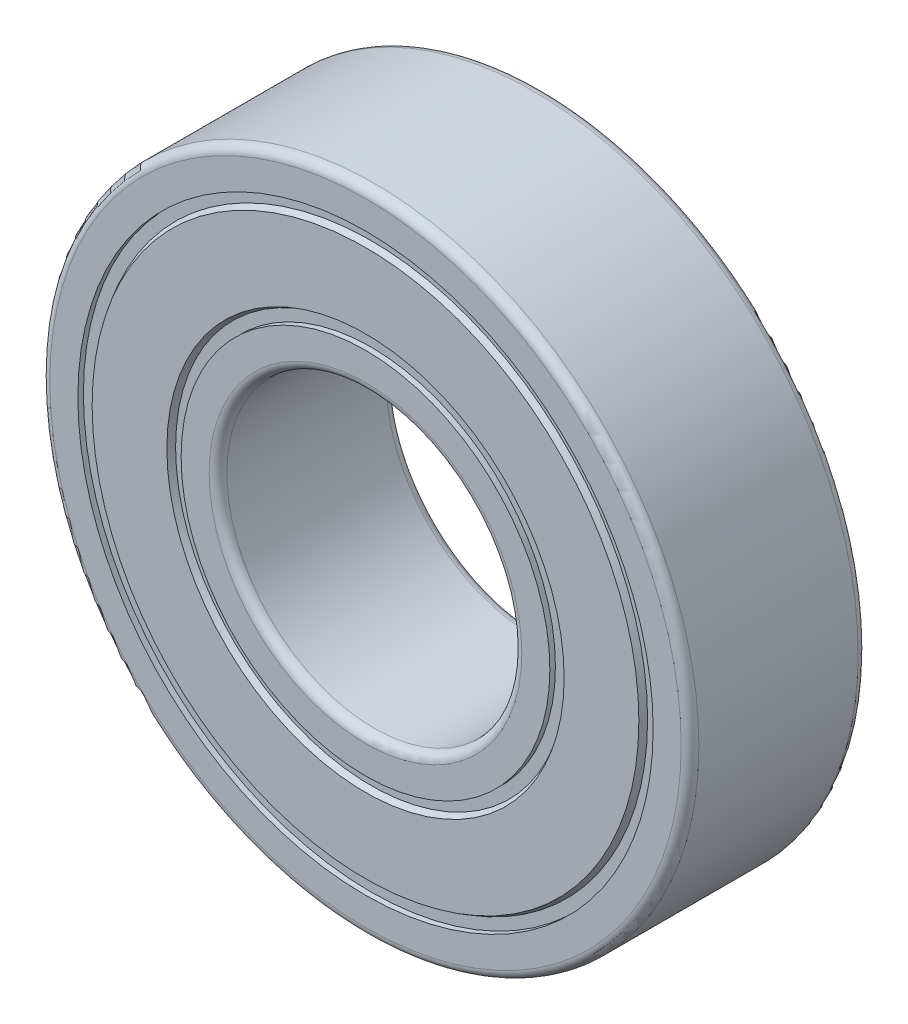
ISO-10303-21;
HEADER;
FILE_DESCRIPTION(('STEP AP214'),'2;1');
FILE_NAME('part.step','',(''),(''),'','','');
FILE_SCHEMA(('AUTOMOTIVE_DESIGN { 1 0 10303 214 1 1 1 1 }'));
ENDSEC;
DATA;
#1=APPLICATION_CONTEXT('core data for automotive mechanical design processes');
#2=APPLICATION_PROTOCOL_DEFINITION('international standard','automotive_design',2000,#1);
#3=PRODUCT_CONTEXT('',#1,'mechanical');
#4=PRODUCT('Part','Part','',(#3));
#5=PRODUCT_RELATED_PRODUCT_CATEGORY('part','',(#4));
#6=PRODUCT_DEFINITION_FORMATION('','',#4);
#7=PRODUCT_DEFINITION_CONTEXT('part definition',#1,'design');
#8=PRODUCT_DEFINITION('design','',#6,#7);
#9=PRODUCT_DEFINITION_SHAPE('','',#8);
#10=(LENGTH_UNIT() NAMED_UNIT(*) SI_UNIT(.MILLI.,.METRE.));
#11=(NAMED_UNIT(*) PLANE_ANGLE_UNIT() SI_UNIT($,.RADIAN.));
#12=(NAMED_UNIT(*) SI_UNIT($,.STERADIAN.) SOLID_ANGLE_UNIT());
#13=UNCERTAINTY_MEASURE_WITH_UNIT(LENGTH_MEASURE(1.E-05),#10,'distance_accuracy_value','');
#14=(GEOMETRIC_REPRESENTATION_CONTEXT(3) GLOBAL_UNCERTAINTY_ASSIGNED_CONTEXT((#13)) GLOBAL_UNIT_ASSIGNED_CONTEXT((#10,
#11,#12)) REPRESENTATION_CONTEXT('',''));
#15=CARTESIAN_POINT('',(0.,0.,0.));
#16=DIRECTION('',(0.,0.,1.));
#17=DIRECTION('',(1.,0.,0.));
#18=AXIS2_PLACEMENT_3D('',#15,#16,#17);
#19=CARTESIAN_POINT('',(-9.75,0.,6.));
#20=DIRECTION('',(0.,0.,-1.));
#21=DIRECTION('',(-1.,0.,0.));
#22=AXIS2_PLACEMENT_3D('',#19,#20,#21);
#23=PLANE('',#22);
#24=CARTESIAN_POINT('',(0.,0.,6.));
#25=DIRECTION('',(0.,0.,1.));
#26=DIRECTION('',(1.,0.,0.));
#27=AXIS2_PLACEMENT_3D('',#24,#25,#26);
#28=CIRCLE('',#27,9.75);
#29=CARTESIAN_POINT('',(9.75,0.,6.));
#30=VERTEX_POINT('',#29);
#31=EDGE_CURVE('E10',#30,#30,#28,.T.);
#32=ORIENTED_EDGE('',*,*,#31,.F.);
#33=EDGE_LOOP('',(#32));
#34=FACE_BOUND('',#33,.T.);
#35=CARTESIAN_POINT('',(0.,0.,6.));
#36=DIRECTION('',(0.,0.,1.));
#37=DIRECTION('',(1.,0.,0.));
#38=AXIS2_PLACEMENT_3D('',#35,#36,#37);
#39=CIRCLE('',#38,10.7);
#40=CARTESIAN_POINT('',(10.7,0.,6.));
#41=VERTEX_POINT('',#40);
#42=EDGE_CURVE('E111',#41,#41,#39,.T.);
#43=ORIENTED_EDGE('',*,*,#42,.T.);
#44=EDGE_LOOP('',(#43));
#45=FACE_BOUND('',#44,.T.);
#46=ADVANCED_FACE('F34',(#34,#45),#23,.F.);
#47=CARTESIAN_POINT('',(0.,0.,19.));
#48=DIRECTION('',(0.,0.,1.));
#49=DIRECTION('',(1.,0.,0.));
#50=AXIS2_PLACEMENT_3D('',#47,#48,#49);
#51=CYLINDRICAL_SURFACE('',#50,9.75);
#52=CARTESIAN_POINT('',(0.,0.,5.8125));
#53=DIRECTION('',(0.,0.,1.));
#54=DIRECTION('',(1.,0.,0.));
#55=AXIS2_PLACEMENT_3D('',#52,#53,#54);
#56=CIRCLE('',#55,9.75);
#57=CARTESIAN_POINT('',(9.75,0.,5.8125));
#58=VERTEX_POINT('',#57);
#59=EDGE_CURVE('E41',#58,#58,#56,.T.);
#60=ORIENTED_EDGE('',*,*,#59,.F.);
#61=EDGE_LOOP('',(#60));
#62=FACE_BOUND('',#61,.T.);
#63=ORIENTED_EDGE('',*,*,#31,.T.);
#64=EDGE_LOOP('',(#63));
#65=FACE_BOUND('',#64,.T.);
#66=ADVANCED_FACE('F244',(#62,#65),#51,.F.);
#67=CARTESIAN_POINT('',(-9.75,0.,5.8125));
#68=DIRECTION('',(0.,0.,-1.));
#69=DIRECTION('',(-1.,0.,0.));
#70=AXIS2_PLACEMENT_3D('',#67,#68,#69);
#71=PLANE('',#70);
#72=CARTESIAN_POINT('',(0.,0.,5.8125));
#73=DIRECTION('',(0.,0.,1.));
#74=DIRECTION('',(1.,0.,0.));
#75=AXIS2_PLACEMENT_3D('',#72,#73,#74);
#76=CIRCLE('',#75,9.375);
#77=CARTESIAN_POINT('',(9.375,0.,5.8125));
#78=VERTEX_POINT('',#77);
#79=EDGE_CURVE('E45',#78,#78,#76,.T.);
#80=ORIENTED_EDGE('',*,*,#79,.F.);
#81=EDGE_LOOP('',(#80));
#82=FACE_BOUND('',#81,.T.);
#83=ORIENTED_EDGE('',*,*,#59,.T.);
#84=EDGE_LOOP('',(#83));
#85=FACE_BOUND('',#84,.T.);
#86=ADVANCED_FACE('F239',(#82,#85),#71,.F.);
#87=CARTESIAN_POINT('',(0.,0.,5.8125));
#88=DIRECTION('',(0.,0.,-1.));
#89=DIRECTION('',(-1.,0.,0.));
#90=AXIS2_PLACEMENT_3D('',#87,#88,#89);
#91=CONICAL_SURFACE('',#90,9.375,0.523598775598294);
#92=CARTESIAN_POINT('',(0.,0.,6.));
#93=DIRECTION('',(0.,0.,1.));
#94=DIRECTION('',(1.,0.,0.));
#95=AXIS2_PLACEMENT_3D('',#92,#93,#94);
#96=CIRCLE('',#95,9.26674682452695);
#97=CARTESIAN_POINT('',(9.26674682452695,0.,6.));
#98=VERTEX_POINT('',#97);
#99=EDGE_CURVE('E49',#98,#98,#96,.T.);
#100=ORIENTED_EDGE('',*,*,#99,.F.);
#101=EDGE_LOOP('',(#100));
#102=FACE_BOUND('',#101,.T.);
#103=ORIENTED_EDGE('',*,*,#79,.T.);
#104=EDGE_LOOP('',(#103));
#105=FACE_BOUND('',#104,.T.);
#106=ADVANCED_FACE('F233',(#102,#105),#91,.T.);
#107=CARTESIAN_POINT('',(-9.26674682452695,0.,6.));
#108=DIRECTION('',(0.,0.,-1.));
#109=DIRECTION('',(-1.,0.,0.));
#110=AXIS2_PLACEMENT_3D('',#107,#108,#109);
#111=PLANE('',#110);
#112=CARTESIAN_POINT('',(0.,0.,6.));
#113=DIRECTION('',(0.,0.,1.));
#114=DIRECTION('',(1.,0.,0.));
#115=AXIS2_PLACEMENT_3D('',#112,#113,#114);
#116=CIRCLE('',#115,6.73325317547306);
#117=CARTESIAN_POINT('',(6.73325317547306,0.,6.));
#118=VERTEX_POINT('',#117);
#119=EDGE_CURVE('E54',#118,#118,#116,.T.);
#120=ORIENTED_EDGE('',*,*,#119,.F.);
#121=EDGE_LOOP('',(#120));
#122=FACE_BOUND('',#121,.T.);
#123=ORIENTED_EDGE('',*,*,#99,.T.);
#124=EDGE_LOOP('',(#123));
#125=FACE_BOUND('',#124,.T.);
#126=ADVANCED_FACE('F227',(#122,#125),#111,.F.);
#127=CARTESIAN_POINT('',(0.,0.,6.));
#128=DIRECTION('',(0.,0.,1.));
#129=DIRECTION('',(1.,0.,0.));
#130=AXIS2_PLACEMENT_3D('',#127,#128,#129);
#131=CONICAL_SURFACE('',#130,6.73325317547306,0.523598775598301);
#132=CARTESIAN_POINT('',(0.,0.,5.8125));
#133=DIRECTION('',(0.,0.,1.));
#134=DIRECTION('',(1.,0.,0.));
#135=AXIS2_PLACEMENT_3D('',#132,#133,#134);
#136=CIRCLE('',#135,6.625);
#137=CARTESIAN_POINT('',(6.625,0.,5.8125));
#138=VERTEX_POINT('',#137);
#139=EDGE_CURVE('E57',#138,#138,#136,.T.);
#140=ORIENTED_EDGE('',*,*,#139,.F.);
#141=EDGE_LOOP('',(#140));
#142=FACE_BOUND('',#141,.T.);
#143=ORIENTED_EDGE('',*,*,#119,.T.);
#144=EDGE_LOOP('',(#143));
#145=FACE_BOUND('',#144,.T.);
#146=ADVANCED_FACE('F221',(#142,#145),#131,.F.);
#147=CARTESIAN_POINT('',(-6.25,0.,5.8125));
#148=DIRECTION('',(0.,0.,-1.));
#149=DIRECTION('',(-1.,0.,0.));
#150=AXIS2_PLACEMENT_3D('',#147,#148,#149);
#151=PLANE('',#150);
#152=CARTESIAN_POINT('',(0.,0.,5.8125));
#153=DIRECTION('',(0.,0.,1.));
#154=DIRECTION('',(1.,0.,0.));
#155=AXIS2_PLACEMENT_3D('',#152,#153,#154);
#156=CIRCLE('',#155,6.25);
#157=CARTESIAN_POINT('',(6.25,0.,5.8125));
#158=VERTEX_POINT('',#157);
#159=EDGE_CURVE('E60',#158,#158,#156,.T.);
#160=ORIENTED_EDGE('',*,*,#159,.F.);
#161=EDGE_LOOP('',(#160));
#162=FACE_BOUND('',#161,.T.);
#163=ORIENTED_EDGE('',*,*,#139,.T.);
#164=EDGE_LOOP('',(#163));
#165=FACE_BOUND('',#164,.T.);
#166=ADVANCED_FACE('F215',(#162,#165),#151,.F.);
#167=CARTESIAN_POINT('',(0.,0.,19.));
#168=DIRECTION('',(0.,0.,1.));
#169=DIRECTION('',(1.,0.,0.));
#170=AXIS2_PLACEMENT_3D('',#167,#168,#169);
#171=CYLINDRICAL_SURFACE('',#170,6.25);
#172=CARTESIAN_POINT('',(0.,0.,6.));
#173=DIRECTION('',(0.,0.,1.));
#174=DIRECTION('',(1.,0.,0.));
#175=AXIS2_PLACEMENT_3D('',#172,#173,#174);
#176=CIRCLE('',#175,6.25);
#177=CARTESIAN_POINT('',(6.25,0.,6.));
#178=VERTEX_POINT('',#177);
#179=EDGE_CURVE('E63',#178,#178,#176,.T.);
#180=ORIENTED_EDGE('',*,*,#179,.F.);
#181=EDGE_LOOP('',(#180));
#182=FACE_BOUND('',#181,.T.);
#183=ORIENTED_EDGE('',*,*,#159,.T.);
#184=EDGE_LOOP('',(#183));
#185=FACE_BOUND('',#184,.T.);
#186=ADVANCED_FACE('F209',(#182,#185),#171,.T.);
#187=CARTESIAN_POINT('',(-5.3,0.,6.));
#188=DIRECTION('',(0.,0.,-1.));
#189=DIRECTION('',(-1.,0.,0.));
#190=AXIS2_PLACEMENT_3D('',#187,#188,#189);
#191=PLANE('',#190);
#192=CARTESIAN_POINT('',(0.,0.,6.));
#193=DIRECTION('',(0.,0.,1.));
#194=DIRECTION('',(1.,0.,0.));
#195=AXIS2_PLACEMENT_3D('',#192,#193,#194);
#196=CIRCLE('',#195,5.3);
#197=CARTESIAN_POINT('',(5.3,0.,6.));
#198=VERTEX_POINT('',#197);
#199=EDGE_CURVE('E66',#198,#198,#196,.T.);
#200=ORIENTED_EDGE('',*,*,#199,.F.);
#201=EDGE_LOOP('',(#200));
#202=FACE_BOUND('',#201,.T.);
#203=ORIENTED_EDGE('',*,*,#179,.T.);
#204=EDGE_LOOP('',(#203));
#205=FACE_BOUND('',#204,.T.);
#206=ADVANCED_FACE('F203',(#202,#205),#191,.F.);
#207=CARTESIAN_POINT('',(0.,0.,5.7));
#208=DIRECTION('',(0.,0.,1.));
#209=DIRECTION('',(1.,0.,0.));
#210=AXIS2_PLACEMENT_3D('',#207,#208,#209);
#211=TOROIDAL_SURFACE('',#210,5.3,0.3);
#212=CARTESIAN_POINT('',(0.,0.,5.7));
#213=DIRECTION('',(0.,0.,1.));
#214=DIRECTION('',(1.,0.,0.));
#215=AXIS2_PLACEMENT_3D('',#212,#213,#214);
#216=CIRCLE('',#215,5.);
#217=CARTESIAN_POINT('',(5.,0.,5.7));
#218=VERTEX_POINT('',#217);
#219=EDGE_CURVE('E69',#218,#218,#216,.T.);
#220=ORIENTED_EDGE('',*,*,#219,.F.);
#221=EDGE_LOOP('',(#220));
#222=FACE_BOUND('',#221,.T.);
#223=ORIENTED_EDGE('',*,*,#199,.T.);
#224=EDGE_LOOP('',(#223));
#225=FACE_BOUND('',#224,.T.);
#226=ADVANCED_FACE('F197',(#222,#225),#211,.T.);
#227=CARTESIAN_POINT('',(0.,0.,19.));
#228=DIRECTION('',(0.,0.,1.));
#229=DIRECTION('',(1.,0.,0.));
#230=AXIS2_PLACEMENT_3D('',#227,#228,#229);
#231=CYLINDRICAL_SURFACE('',#230,5.);
#232=CARTESIAN_POINT('',(0.,0.,0.300000000000002));
#233=DIRECTION('',(0.,0.,1.));
#234=DIRECTION('',(1.,0.,0.));
#235=AXIS2_PLACEMENT_3D('',#232,#233,#234);
#236=CIRCLE('',#235,5.);
#237=CARTESIAN_POINT('',(5.,0.,0.300000000000002));
#238=VERTEX_POINT('',#237);
#239=EDGE_CURVE('E72',#238,#238,#236,.T.);
#240=ORIENTED_EDGE('',*,*,#239,.F.);
#241=EDGE_LOOP('',(#240));
#242=FACE_BOUND('',#241,.T.);
#243=ORIENTED_EDGE('',*,*,#219,.T.);
#244=EDGE_LOOP('',(#243));
#245=FACE_BOUND('',#244,.T.);
#246=ADVANCED_FACE('F191',(#242,#245),#231,.F.);
#247=CARTESIAN_POINT('',(0.,0.,0.300000000000002));
#248=DIRECTION('',(0.,0.,1.));
#249=DIRECTION('',(1.,0.,0.));
#250=AXIS2_PLACEMENT_3D('',#247,#248,#249);
#251=TOROIDAL_SURFACE('',#250,5.3,0.3);
#252=CARTESIAN_POINT('',(0.,0.,0.));
#253=DIRECTION('',(0.,0.,1.));
#254=DIRECTION('',(1.,0.,0.));
#255=AXIS2_PLACEMENT_3D('',#252,#253,#254);
#256=CIRCLE('',#255,5.3);
#257=CARTESIAN_POINT('',(5.3,0.,0.));
#258=VERTEX_POINT('',#257);
#259=EDGE_CURVE('E75',#258,#258,#256,.T.);
#260=ORIENTED_EDGE('',*,*,#259,.F.);
#261=EDGE_LOOP('',(#260));
#262=FACE_BOUND('',#261,.T.);
#263=ORIENTED_EDGE('',*,*,#239,.T.);
#264=EDGE_LOOP('',(#263));
#265=FACE_BOUND('',#264,.T.);
#266=ADVANCED_FACE('F185',(#262,#265),#251,.T.);
#267=CARTESIAN_POINT('',(-5.3,0.,0.));
#268=DIRECTION('',(0.,0.,1.));
#269=DIRECTION('',(1.,0.,0.));
#270=AXIS2_PLACEMENT_3D('',#267,#268,#269);
#271=PLANE('',#270);
#272=CARTESIAN_POINT('',(0.,0.,0.));
#273=DIRECTION('',(0.,0.,1.));
#274=DIRECTION('',(1.,0.,0.));
#275=AXIS2_PLACEMENT_3D('',#272,#273,#274);
#276=CIRCLE('',#275,6.25);
#277=CARTESIAN_POINT('',(6.25,0.,0.));
#278=VERTEX_POINT('',#277);
#279=EDGE_CURVE('E78',#278,#278,#276,.T.);
#280=ORIENTED_EDGE('',*,*,#279,.F.);
#281=EDGE_LOOP('',(#280));
#282=FACE_BOUND('',#281,.T.);
#283=ORIENTED_EDGE('',*,*,#259,.T.);
#284=EDGE_LOOP('',(#283));
#285=FACE_BOUND('',#284,.T.);
#286=ADVANCED_FACE('F179',(#282,#285),#271,.F.);
#287=CARTESIAN_POINT('',(0.,0.,19.));
#288=DIRECTION('',(0.,0.,1.));
#289=DIRECTION('',(1.,0.,0.));
#290=AXIS2_PLACEMENT_3D('',#287,#288,#289);
#291=CYLINDRICAL_SURFACE('',#290,6.25);
#292=CARTESIAN_POINT('',(0.,0.,0.1875));
#293=DIRECTION('',(0.,0.,1.));
#294=DIRECTION('',(1.,0.,0.));
#295=AXIS2_PLACEMENT_3D('',#292,#293,#294);
#296=CIRCLE('',#295,6.25);
#297=CARTESIAN_POINT('',(6.25,0.,0.1875));
#298=VERTEX_POINT('',#297);
#299=EDGE_CURVE('E81',#298,#298,#296,.T.);
#300=ORIENTED_EDGE('',*,*,#299,.F.);
#301=EDGE_LOOP('',(#300));
#302=FACE_BOUND('',#301,.T.);
#303=ORIENTED_EDGE('',*,*,#279,.T.);
#304=EDGE_LOOP('',(#303));
#305=FACE_BOUND('',#304,.T.);
#306=ADVANCED_FACE('F173',(#302,#305),#291,.T.);
#307=CARTESIAN_POINT('',(-6.25,0.,0.187500000000001));
#308=DIRECTION('',(0.,0.,1.));
#309=DIRECTION('',(1.,0.,0.));
#310=AXIS2_PLACEMENT_3D('',#307,#308,#309);
#311=PLANE('',#310);
#312=CARTESIAN_POINT('',(0.,0.,0.1875));
#313=DIRECTION('',(0.,0.,1.));
#314=DIRECTION('',(1.,0.,0.));
#315=AXIS2_PLACEMENT_3D('',#312,#313,#314);
#316=CIRCLE('',#315,6.625);
#317=CARTESIAN_POINT('',(6.625,0.,0.1875));
#318=VERTEX_POINT('',#317);
#319=EDGE_CURVE('E84',#318,#318,#316,.T.);
#320=ORIENTED_EDGE('',*,*,#319,.F.);
#321=EDGE_LOOP('',(#320));
#322=FACE_BOUND('',#321,.T.);
#323=ORIENTED_EDGE('',*,*,#299,.T.);
#324=EDGE_LOOP('',(#323));
#325=FACE_BOUND('',#324,.T.);
#326=ADVANCED_FACE('F167',(#322,#325),#311,.F.);
#327=CARTESIAN_POINT('',(0.,0.,0.1875));
#328=DIRECTION('',(0.,0.,-1.));
#329=DIRECTION('',(-1.,0.,0.));
#330=AXIS2_PLACEMENT_3D('',#327,#328,#329);
#331=CONICAL_SURFACE('',#330,6.625,0.523598775598301);
#332=CARTESIAN_POINT('',(0.,0.,0.));
#333=DIRECTION('',(0.,0.,1.));
#334=DIRECTION('',(1.,0.,0.));
#335=AXIS2_PLACEMENT_3D('',#332,#333,#334);
#336=CIRCLE('',#335,6.73325317547306);
#337=CARTESIAN_POINT('',(6.73325317547306,0.,0.));
#338=VERTEX_POINT('',#337);
#339=EDGE_CURVE('E87',#338,#338,#336,.T.);
#340=ORIENTED_EDGE('',*,*,#339,.F.);
#341=EDGE_LOOP('',(#340));
#342=FACE_BOUND('',#341,.T.);
#343=ORIENTED_EDGE('',*,*,#319,.T.);
#344=EDGE_LOOP('',(#343));
#345=FACE_BOUND('',#344,.T.);
#346=ADVANCED_FACE('F161',(#342,#345),#331,.F.);
#347=CARTESIAN_POINT('',(-9.26674682452695,0.,0.));
#348=DIRECTION('',(0.,0.,1.));
#349=DIRECTION('',(1.,0.,0.));
#350=AXIS2_PLACEMENT_3D('',#347,#348,#349);
#351=PLANE('',#350);
#352=CARTESIAN_POINT('',(0.,0.,0.));
#353=DIRECTION('',(0.,0.,1.));
#354=DIRECTION('',(1.,0.,0.));
#355=AXIS2_PLACEMENT_3D('',#352,#353,#354);
#356=CIRCLE('',#355,9.26674682452695);
#357=CARTESIAN_POINT('',(9.26674682452695,0.,0.));
#358=VERTEX_POINT('',#357);
#359=EDGE_CURVE('E90',#358,#358,#356,.T.);
#360=ORIENTED_EDGE('',*,*,#359,.F.);
#361=EDGE_LOOP('',(#360));
#362=FACE_BOUND('',#361,.T.);
#363=ORIENTED_EDGE('',*,*,#339,.T.);
#364=EDGE_LOOP('',(#363));
#365=FACE_BOUND('',#364,.T.);
#366=ADVANCED_FACE('F155',(#362,#365),#351,.F.);
#367=CARTESIAN_POINT('',(0.,0.,0.));
#368=DIRECTION('',(0.,0.,1.));
#369=DIRECTION('',(1.,0.,0.));
#370=AXIS2_PLACEMENT_3D('',#367,#368,#369);
#371=CONICAL_SURFACE('',#370,9.26674682452695,0.523598775598294);
#372=CARTESIAN_POINT('',(0.,0.,0.1875));
#373=DIRECTION('',(0.,0.,1.));
#374=DIRECTION('',(1.,0.,0.));
#375=AXIS2_PLACEMENT_3D('',#372,#373,#374);
#376=CIRCLE('',#375,9.375);
#377=CARTESIAN_POINT('',(9.375,0.,0.1875));
#378=VERTEX_POINT('',#377);
#379=EDGE_CURVE('E93',#378,#378,#376,.T.);
#380=ORIENTED_EDGE('',*,*,#379,.F.);
#381=EDGE_LOOP('',(#380));
#382=FACE_BOUND('',#381,.T.);
#383=ORIENTED_EDGE('',*,*,#359,.T.);
#384=EDGE_LOOP('',(#383));
#385=FACE_BOUND('',#384,.T.);
#386=ADVANCED_FACE('F149',(#382,#385),#371,.T.);
#387=CARTESIAN_POINT('',(-9.75,0.,0.187500000000001));
#388=DIRECTION('',(0.,0.,1.));
#389=DIRECTION('',(1.,0.,0.));
#390=AXIS2_PLACEMENT_3D('',#387,#388,#389);
#391=PLANE('',#390);
#392=CARTESIAN_POINT('',(0.,0.,0.1875));
#393=DIRECTION('',(0.,0.,1.));
#394=DIRECTION('',(1.,0.,0.));
#395=AXIS2_PLACEMENT_3D('',#392,#393,#394);
#396=CIRCLE('',#395,9.75);
#397=CARTESIAN_POINT('',(9.75,0.,0.1875));
#398=VERTEX_POINT('',#397);
#399=EDGE_CURVE('E96',#398,#398,#396,.T.);
#400=ORIENTED_EDGE('',*,*,#399,.F.);
#401=EDGE_LOOP('',(#400));
#402=FACE_BOUND('',#401,.T.);
#403=ORIENTED_EDGE('',*,*,#379,.T.);
#404=EDGE_LOOP('',(#403));
#405=FACE_BOUND('',#404,.T.);
#406=ADVANCED_FACE('F143',(#402,#405),#391,.F.);
#407=CARTESIAN_POINT('',(0.,0.,19.));
#408=DIRECTION('',(0.,0.,1.));
#409=DIRECTION('',(1.,0.,0.));
#410=AXIS2_PLACEMENT_3D('',#407,#408,#409);
#411=CYLINDRICAL_SURFACE('',#410,9.75);
#412=CARTESIAN_POINT('',(0.,0.,0.));
#413=DIRECTION('',(0.,0.,1.));
#414=DIRECTION('',(1.,0.,0.));
#415=AXIS2_PLACEMENT_3D('',#412,#413,#414);
#416=CIRCLE('',#415,9.75);
#417=CARTESIAN_POINT('',(9.75,0.,0.));
#418=VERTEX_POINT('',#417);
#419=EDGE_CURVE('E99',#418,#418,#416,.T.);
#420=ORIENTED_EDGE('',*,*,#419,.F.);
#421=EDGE_LOOP('',(#420));
#422=FACE_BOUND('',#421,.T.);
#423=ORIENTED_EDGE('',*,*,#399,.T.);
#424=EDGE_LOOP('',(#423));
#425=FACE_BOUND('',#424,.T.);
#426=ADVANCED_FACE('F137',(#422,#425),#411,.F.);
#427=CARTESIAN_POINT('',(-9.75,0.,0.));
#428=DIRECTION('',(0.,0.,1.));
#429=DIRECTION('',(1.,0.,0.));
#430=AXIS2_PLACEMENT_3D('',#427,#428,#429);
#431=PLANE('',#430);
#432=CARTESIAN_POINT('',(0.,0.,0.));
#433=DIRECTION('',(0.,0.,1.));
#434=DIRECTION('',(1.,0.,0.));
#435=AXIS2_PLACEMENT_3D('',#432,#433,#434);
#436=CIRCLE('',#435,10.7);
#437=CARTESIAN_POINT('',(10.7,0.,0.));
#438=VERTEX_POINT('',#437);
#439=EDGE_CURVE('E102',#438,#438,#436,.T.);
#440=ORIENTED_EDGE('',*,*,#439,.F.);
#441=EDGE_LOOP('',(#440));
#442=FACE_BOUND('',#441,.T.);
#443=ORIENTED_EDGE('',*,*,#419,.T.);
#444=EDGE_LOOP('',(#443));
#445=FACE_BOUND('',#444,.T.);
#446=ADVANCED_FACE('F131',(#442,#445),#431,.F.);
#447=CARTESIAN_POINT('',(0.,0.,0.300000000000001));
#448=DIRECTION('',(0.,0.,1.));
#449=DIRECTION('',(1.,0.,0.));
#450=AXIS2_PLACEMENT_3D('',#447,#448,#449);
#451=TOROIDAL_SURFACE('',#450,10.7,0.3);
#452=CARTESIAN_POINT('',(0.,0.,0.300000000000002));
#453=DIRECTION('',(0.,0.,1.));
#454=DIRECTION('',(1.,0.,0.));
#455=AXIS2_PLACEMENT_3D('',#452,#453,#454);
#456=CIRCLE('',#455,11.);
#457=CARTESIAN_POINT('',(11.,0.,0.300000000000002));
#458=VERTEX_POINT('',#457);
#459=EDGE_CURVE('E105',#458,#458,#456,.T.);
#460=ORIENTED_EDGE('',*,*,#459,.F.);
#461=EDGE_LOOP('',(#460));
#462=FACE_BOUND('',#461,.T.);
#463=ORIENTED_EDGE('',*,*,#439,.T.);
#464=EDGE_LOOP('',(#463));
#465=FACE_BOUND('',#464,.T.);
#466=ADVANCED_FACE('F125',(#462,#465),#451,.T.);
#467=CARTESIAN_POINT('',(0.,0.,19.));
#468=DIRECTION('',(0.,0.,1.));
#469=DIRECTION('',(1.,0.,0.));
#470=AXIS2_PLACEMENT_3D('',#467,#468,#469);
#471=CYLINDRICAL_SURFACE('',#470,11.);
#472=CARTESIAN_POINT('',(0.,0.,5.7));
#473=DIRECTION('',(0.,0.,1.));
#474=DIRECTION('',(1.,0.,0.));
#475=AXIS2_PLACEMENT_3D('',#472,#473,#474);
#476=CIRCLE('',#475,11.);
#477=CARTESIAN_POINT('',(11.,0.,5.7));
#478=VERTEX_POINT('',#477);
#479=EDGE_CURVE('E108',#478,#478,#476,.T.);
#480=ORIENTED_EDGE('',*,*,#479,.F.);
#481=EDGE_LOOP('',(#480));
#482=FACE_BOUND('',#481,.T.);
#483=ORIENTED_EDGE('',*,*,#459,.T.);
#484=EDGE_LOOP('',(#483));
#485=FACE_BOUND('',#484,.T.);
#486=ADVANCED_FACE('F119',(#482,#485),#471,.T.);
#487=CARTESIAN_POINT('',(0.,0.,5.7));
#488=DIRECTION('',(0.,0.,1.));
#489=DIRECTION('',(1.,0.,0.));
#490=AXIS2_PLACEMENT_3D('',#487,#488,#489);
#491=TOROIDAL_SURFACE('',#490,10.7,0.3);
#492=ORIENTED_EDGE('',*,*,#42,.F.);
#493=EDGE_LOOP('',(#492));
#494=FACE_BOUND('',#493,.T.);
#495=ORIENTED_EDGE('',*,*,#479,.T.);
#496=EDGE_LOOP('',(#495));
#497=FACE_BOUND('',#496,.T.);
#498=ADVANCED_FACE('F116',(#494,#497),#491,.T.);
#499=CLOSED_SHELL('',(#46,#66,#86,#106,#126,#146,#166,#186,#206,#226,#246,#266,#286,#306,#326,
#346,#366,#386,#406,#426,#446,#466,#486,#498));
#500=CARTESIAN_POINT('',(0.,0.,3.));
#501=DIRECTION('',(0.,0.,1.));
#502=DIRECTION('',(1.,0.,0.));
#503=AXIS2_PLACEMENT_3D('',#500,#501,#502);
#504=TOROIDAL_SURFACE('',#503,8.,1.875);
#505=CARTESIAN_POINT('',(9.875,0.,3.));
#506=VERTEX_POINT('',#505);
#507=VERTEX_LOOP('',#506);
#508=FACE_BOUND('',#507,.T.);
#509=ADVANCED_FACE('F406',(#508),#504,.F.);
#510=CLOSED_SHELL('',(#509));
#511=ORIENTED_CLOSED_SHELL('',*,#510,.T.);
#512=BREP_WITH_VOIDS('B2',#499,(#511));
#513=ADVANCED_BREP_SHAPE_REPRESENTATION('',(#18,#512),#14);
#514=SHAPE_DEFINITION_REPRESENTATION(#9,#513);
ENDSEC;
END-ISO-10303-21;
